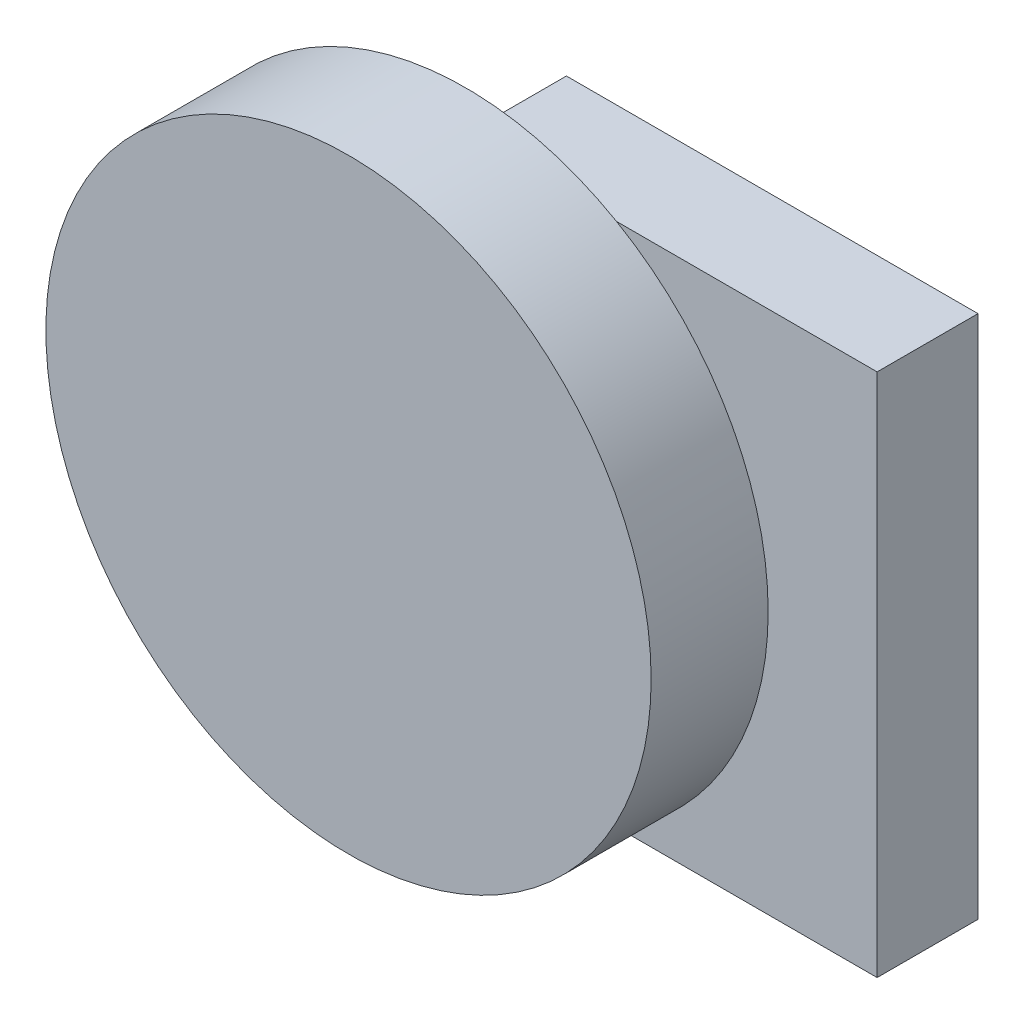
ISO-10303-21;
HEADER;
FILE_DESCRIPTION(('STEP AP214'),'2;1');
FILE_NAME('part.step','',(''),(''),'','','');
FILE_SCHEMA(('AUTOMOTIVE_DESIGN { 1 0 10303 214 1 1 1 1 }'));
ENDSEC;
DATA;
#1=APPLICATION_CONTEXT('core data for automotive mechanical design processes');
#2=APPLICATION_PROTOCOL_DEFINITION('international standard','automotive_design',2000,#1);
#3=PRODUCT_CONTEXT('',#1,'mechanical');
#4=PRODUCT('Part','Part','',(#3));
#5=PRODUCT_RELATED_PRODUCT_CATEGORY('part','',(#4));
#6=PRODUCT_DEFINITION_FORMATION('','',#4);
#7=PRODUCT_DEFINITION_CONTEXT('part definition',#1,'design');
#8=PRODUCT_DEFINITION('design','',#6,#7);
#9=PRODUCT_DEFINITION_SHAPE('','',#8);
#10=(LENGTH_UNIT() NAMED_UNIT(*) SI_UNIT(.MILLI.,.METRE.));
#11=(NAMED_UNIT(*) PLANE_ANGLE_UNIT() SI_UNIT($,.RADIAN.));
#12=(NAMED_UNIT(*) SI_UNIT($,.STERADIAN.) SOLID_ANGLE_UNIT());
#13=UNCERTAINTY_MEASURE_WITH_UNIT(LENGTH_MEASURE(1.E-05),#10,'distance_accuracy_value','');
#14=(GEOMETRIC_REPRESENTATION_CONTEXT(3) GLOBAL_UNCERTAINTY_ASSIGNED_CONTEXT((#13)) GLOBAL_UNIT_ASSIGNED_CONTEXT((#10,
#11,#12)) REPRESENTATION_CONTEXT('',''));
#15=CARTESIAN_POINT('',(0.,0.,0.));
#16=DIRECTION('',(0.,0.,1.));
#17=DIRECTION('',(1.,0.,0.));
#18=AXIS2_PLACEMENT_3D('',#15,#16,#17);
#19=CARTESIAN_POINT('',(0.,0.,2.5));
#20=DIRECTION('',(-1.,0.,0.));
#21=DIRECTION('',(0.,0.,1.));
#22=AXIS2_PLACEMENT_3D('',#19,#20,#21);
#23=PLANE('',#22);
#24=DIRECTION('',(0.,1.,0.));
#25=VECTOR('',#24,1.);
#26=CARTESIAN_POINT('',(0.,0.,0.));
#27=LINE('',#26,#25);
#28=CARTESIAN_POINT('',(0.,0.,0.));
#29=VERTEX_POINT('',#28);
#30=CARTESIAN_POINT('',(0.,13.,0.));
#31=VERTEX_POINT('',#30);
#32=EDGE_CURVE('E108',#29,#31,#27,.T.);
#33=ORIENTED_EDGE('',*,*,#32,.T.);
#34=DIRECTION('',(0.,0.,-1.));
#35=VECTOR('',#34,1.);
#36=CARTESIAN_POINT('',(0.,13.,2.5));
#37=LINE('',#36,#35);
#38=CARTESIAN_POINT('',(0.,13.,2.5));
#39=VERTEX_POINT('',#38);
#40=EDGE_CURVE('E36',#39,#31,#37,.T.);
#41=ORIENTED_EDGE('',*,*,#40,.F.);
#42=DIRECTION('',(0.,1.,0.));
#43=VECTOR('',#42,1.);
#44=CARTESIAN_POINT('',(0.,0.,2.5));
#45=LINE('',#44,#43);
#46=CARTESIAN_POINT('',(0.,0.,2.5));
#47=VERTEX_POINT('',#46);
#48=EDGE_CURVE('E86',#47,#39,#45,.T.);
#49=ORIENTED_EDGE('',*,*,#48,.F.);
#50=DIRECTION('',(0.,0.,-1.));
#51=VECTOR('',#50,1.);
#52=CARTESIAN_POINT('',(0.,0.,2.5));
#53=LINE('',#52,#51);
#54=EDGE_CURVE('E114',#47,#29,#53,.T.);
#55=ORIENTED_EDGE('',*,*,#54,.T.);
#56=EDGE_LOOP('',(#33,#41,#49,#55));
#57=FACE_BOUND('',#56,.T.);
#58=ADVANCED_FACE('F33',(#57),#23,.F.);
#59=CARTESIAN_POINT('',(0.,13.,2.5));
#60=DIRECTION('',(0.,-1.,0.));
#61=DIRECTION('',(0.,0.,-1.));
#62=AXIS2_PLACEMENT_3D('',#59,#60,#61);
#63=PLANE('',#62);
#64=DIRECTION('',(-1.,0.,0.));
#65=VECTOR('',#64,1.);
#66=CARTESIAN_POINT('',(0.,13.,0.));
#67=LINE('',#66,#65);
#68=CARTESIAN_POINT('',(-10.2,13.,0.));
#69=VERTEX_POINT('',#68);
#70=EDGE_CURVE('E117',#31,#69,#67,.T.);
#71=ORIENTED_EDGE('',*,*,#70,.T.);
#72=DIRECTION('',(0.,0.,-1.));
#73=VECTOR('',#72,1.);
#74=CARTESIAN_POINT('',(-10.2,13.,2.5));
#75=LINE('',#74,#73);
#76=CARTESIAN_POINT('',(-10.2,13.,2.5));
#77=VERTEX_POINT('',#76);
#78=EDGE_CURVE('E94',#77,#69,#75,.T.);
#79=ORIENTED_EDGE('',*,*,#78,.F.);
#80=DIRECTION('',(-1.,0.,0.));
#81=VECTOR('',#80,1.);
#82=CARTESIAN_POINT('',(0.,13.,2.5));
#83=LINE('',#82,#81);
#84=CARTESIAN_POINT('',(-6.45834261322606,13.,2.5));
#85=VERTEX_POINT('',#84);
#86=EDGE_CURVE('E89',#85,#77,#83,.T.);
#87=ORIENTED_EDGE('',*,*,#86,.F.);
#88=EDGE_CURVE('E81',#39,#85,#83,.T.);
#89=ORIENTED_EDGE('',*,*,#88,.F.);
#90=ORIENTED_EDGE('',*,*,#40,.T.);
#91=EDGE_LOOP('',(#71,#79,#87,#89,#90));
#92=FACE_BOUND('',#91,.T.);
#93=ADVANCED_FACE('F92',(#92),#63,.F.);
#94=CARTESIAN_POINT('',(-10.2,0.,2.5));
#95=DIRECTION('',(1.,0.,0.));
#96=DIRECTION('',(0.,0.,-1.));
#97=AXIS2_PLACEMENT_3D('',#94,#95,#96);
#98=PLANE('',#97);
#99=DIRECTION('',(0.,-1.,0.));
#100=VECTOR('',#99,1.);
#101=CARTESIAN_POINT('',(-10.2,0.,0.));
#102=LINE('',#101,#100);
#103=CARTESIAN_POINT('',(-10.2,0.,0.));
#104=VERTEX_POINT('',#103);
#105=EDGE_CURVE('E119',#69,#104,#102,.T.);
#106=ORIENTED_EDGE('',*,*,#105,.T.);
#107=DIRECTION('',(0.,0.,-1.));
#108=VECTOR('',#107,1.);
#109=CARTESIAN_POINT('',(-10.2,0.,2.5));
#110=LINE('',#109,#108);
#111=CARTESIAN_POINT('',(-10.2,0.,2.5));
#112=VERTEX_POINT('',#111);
#113=EDGE_CURVE('E123',#112,#104,#110,.T.);
#114=ORIENTED_EDGE('',*,*,#113,.F.);
#115=DIRECTION('',(0.,-1.,0.));
#116=VECTOR('',#115,1.);
#117=CARTESIAN_POINT('',(-10.2,0.,2.5));
#118=LINE('',#117,#116);
#119=EDGE_CURVE('E88',#77,#112,#118,.T.);
#120=ORIENTED_EDGE('',*,*,#119,.F.);
#121=ORIENTED_EDGE('',*,*,#78,.T.);
#122=EDGE_LOOP('',(#106,#114,#120,#121));
#123=FACE_BOUND('',#122,.T.);
#124=ADVANCED_FACE('F130',(#123),#98,.F.);
#125=CARTESIAN_POINT('',(0.,0.,2.5));
#126=DIRECTION('',(0.,1.,0.));
#127=DIRECTION('',(-1.,0.,0.));
#128=AXIS2_PLACEMENT_3D('',#125,#126,#127);
#129=PLANE('',#128);
#130=DIRECTION('',(1.,0.,0.));
#131=VECTOR('',#130,1.);
#132=CARTESIAN_POINT('',(0.,0.,0.));
#133=LINE('',#132,#131);
#134=EDGE_CURVE('E74',#104,#29,#133,.T.);
#135=ORIENTED_EDGE('',*,*,#134,.T.);
#136=ORIENTED_EDGE('',*,*,#54,.F.);
#137=DIRECTION('',(1.,0.,0.));
#138=VECTOR('',#137,1.);
#139=CARTESIAN_POINT('',(0.,0.,2.5));
#140=LINE('',#139,#138);
#141=CARTESIAN_POINT('',(-6.45834261322606,0.,2.5));
#142=VERTEX_POINT('',#141);
#143=EDGE_CURVE('E52',#142,#47,#140,.T.);
#144=ORIENTED_EDGE('',*,*,#143,.F.);
#145=EDGE_CURVE('E105',#112,#142,#140,.T.);
#146=ORIENTED_EDGE('',*,*,#145,.F.);
#147=ORIENTED_EDGE('',*,*,#113,.T.);
#148=EDGE_LOOP('',(#135,#136,#144,#146,#147));
#149=FACE_BOUND('',#148,.T.);
#150=ADVANCED_FACE('F131',(#149),#129,.F.);
#151=CARTESIAN_POINT('',(0.,0.,2.5));
#152=DIRECTION('',(0.,0.,1.));
#153=DIRECTION('',(1.,0.,0.));
#154=AXIS2_PLACEMENT_3D('',#151,#152,#153);
#155=PLANE('',#154);
#156=CARTESIAN_POINT('',(-10.2,6.5,2.5));
#157=DIRECTION('',(0.,0.,1.));
#158=DIRECTION('',(1.,0.,0.));
#159=AXIS2_PLACEMENT_3D('',#156,#157,#158);
#160=CIRCLE('',#159,7.5);
#161=EDGE_CURVE('E11',#142,#85,#160,.T.);
#162=ORIENTED_EDGE('',*,*,#161,.F.);
#163=ORIENTED_EDGE('',*,*,#143,.T.);
#164=ORIENTED_EDGE('',*,*,#48,.T.);
#165=ORIENTED_EDGE('',*,*,#88,.T.);
#166=EDGE_LOOP('',(#162,#163,#164,#165));
#167=FACE_BOUND('',#166,.T.);
#168=ADVANCED_FACE('F84',(#167),#155,.T.);
#169=CARTESIAN_POINT('',(0.,0.,0.));
#170=DIRECTION('',(0.,0.,1.));
#171=DIRECTION('',(1.,0.,0.));
#172=AXIS2_PLACEMENT_3D('',#169,#170,#171);
#173=PLANE('',#172);
#174=ORIENTED_EDGE('',*,*,#32,.F.);
#175=ORIENTED_EDGE('',*,*,#134,.F.);
#176=ORIENTED_EDGE('',*,*,#105,.F.);
#177=ORIENTED_EDGE('',*,*,#70,.F.);
#178=EDGE_LOOP('',(#174,#175,#176,#177));
#179=FACE_BOUND('',#178,.T.);
#180=ADVANCED_FACE('F129',(#179),#173,.F.);
#181=CARTESIAN_POINT('',(-10.2,6.5,2.5));
#182=DIRECTION('',(0.,0.,1.));
#183=DIRECTION('',(1.,0.,0.));
#184=AXIS2_PLACEMENT_3D('',#181,#182,#183);
#185=PLANE('',#184);
#186=EDGE_CURVE('E42',#85,#142,#160,.T.);
#187=ORIENTED_EDGE('',*,*,#186,.F.);
#188=ORIENTED_EDGE('',*,*,#86,.T.);
#189=ORIENTED_EDGE('',*,*,#119,.T.);
#190=ORIENTED_EDGE('',*,*,#145,.T.);
#191=EDGE_LOOP('',(#187,#188,#189,#190));
#192=FACE_BOUND('',#191,.T.);
#193=ADVANCED_FACE('F103',(#192),#185,.F.);
#194=CARTESIAN_POINT('',(-10.2,6.5,5.4));
#195=DIRECTION('',(0.,0.,-1.));
#196=DIRECTION('',(-1.,0.,0.));
#197=AXIS2_PLACEMENT_3D('',#194,#195,#196);
#198=CYLINDRICAL_SURFACE('',#197,7.5);
#199=CARTESIAN_POINT('',(-10.2,6.5,5.4));
#200=DIRECTION('',(0.,0.,1.));
#201=DIRECTION('',(1.,0.,0.));
#202=AXIS2_PLACEMENT_3D('',#199,#200,#201);
#203=CIRCLE('',#202,7.5);
#204=CARTESIAN_POINT('',(-2.7,6.5,5.4));
#205=VERTEX_POINT('',#204);
#206=EDGE_CURVE('E106',#205,#205,#203,.T.);
#207=ORIENTED_EDGE('',*,*,#206,.F.);
#208=EDGE_LOOP('',(#207));
#209=FACE_BOUND('',#208,.T.);
#210=ORIENTED_EDGE('',*,*,#186,.T.);
#211=ORIENTED_EDGE('',*,*,#161,.T.);
#212=EDGE_LOOP('',(#210,#211));
#213=FACE_BOUND('',#212,.T.);
#214=ADVANCED_FACE('F101',(#209,#213),#198,.T.);
#215=CARTESIAN_POINT('',(-10.2,6.5,5.4));
#216=DIRECTION('',(0.,0.,1.));
#217=DIRECTION('',(1.,0.,0.));
#218=AXIS2_PLACEMENT_3D('',#215,#216,#217);
#219=PLANE('',#218);
#220=ORIENTED_EDGE('',*,*,#206,.T.);
#221=EDGE_LOOP('',(#220));
#222=FACE_BOUND('',#221,.T.);
#223=ADVANCED_FACE('F181',(#222),#219,.T.);
#224=CLOSED_SHELL('',(#58,#93,#124,#150,#168,#180,#193,#214,#223));
#225=MANIFOLD_SOLID_BREP('B2',#224);
#226=ADVANCED_BREP_SHAPE_REPRESENTATION('',(#18,#225),#14);
#227=SHAPE_DEFINITION_REPRESENTATION(#9,#226);
ENDSEC;
END-ISO-10303-21;
